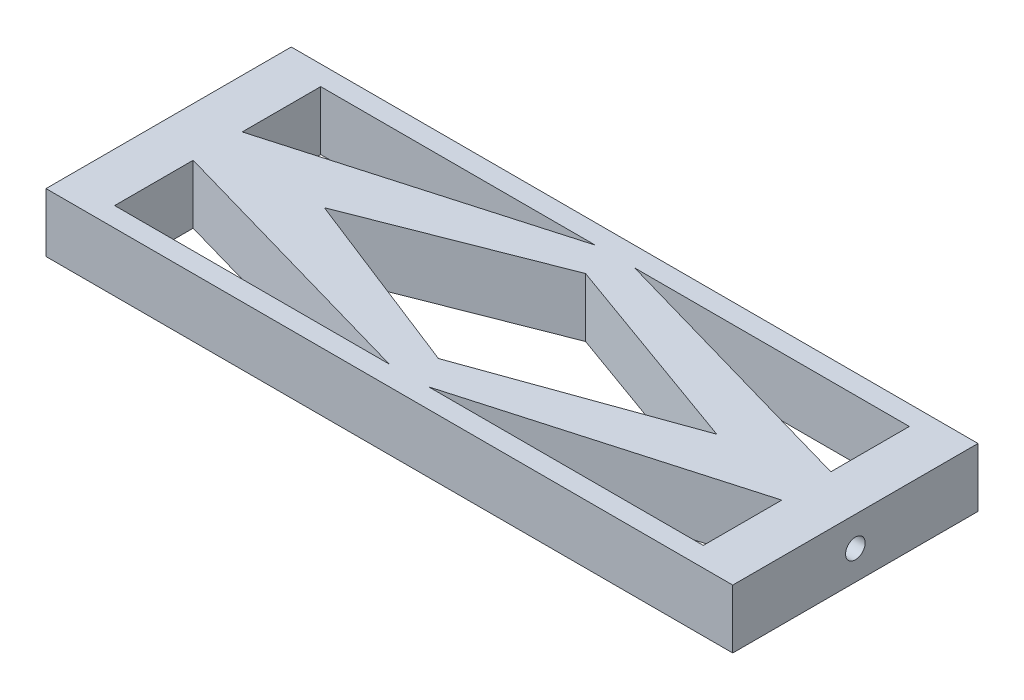
ISO-10303-21;
HEADER;
FILE_DESCRIPTION(('STEP AP214'),'2;1');
FILE_NAME('part.step','',(''),(''),'','','');
FILE_SCHEMA(('AUTOMOTIVE_DESIGN { 1 0 10303 214 1 1 1 1 }'));
ENDSEC;
DATA;
#1=APPLICATION_CONTEXT('core data for automotive mechanical design processes');
#2=APPLICATION_PROTOCOL_DEFINITION('international standard','automotive_design',2000,#1);
#3=PRODUCT_CONTEXT('',#1,'mechanical');
#4=PRODUCT('Part','Part','',(#3));
#5=PRODUCT_RELATED_PRODUCT_CATEGORY('part','',(#4));
#6=PRODUCT_DEFINITION_FORMATION('','',#4);
#7=PRODUCT_DEFINITION_CONTEXT('part definition',#1,'design');
#8=PRODUCT_DEFINITION('design','',#6,#7);
#9=PRODUCT_DEFINITION_SHAPE('','',#8);
#10=(LENGTH_UNIT() NAMED_UNIT(*) SI_UNIT(.MILLI.,.METRE.));
#11=(NAMED_UNIT(*) PLANE_ANGLE_UNIT() SI_UNIT($,.RADIAN.));
#12=(NAMED_UNIT(*) SI_UNIT($,.STERADIAN.) SOLID_ANGLE_UNIT());
#13=UNCERTAINTY_MEASURE_WITH_UNIT(LENGTH_MEASURE(1.E-05),#10,'distance_accuracy_value','');
#14=(GEOMETRIC_REPRESENTATION_CONTEXT(3) GLOBAL_UNCERTAINTY_ASSIGNED_CONTEXT((#13)) GLOBAL_UNIT_ASSIGNED_CONTEXT((#10,
#11,#12)) REPRESENTATION_CONTEXT('',''));
#15=CARTESIAN_POINT('',(0.,0.,0.));
#16=DIRECTION('',(0.,0.,1.));
#17=DIRECTION('',(1.,0.,0.));
#18=AXIS2_PLACEMENT_3D('',#15,#16,#17);
#19=CARTESIAN_POINT('',(-44.45,7.62,15.875));
#20=DIRECTION('',(1.,0.,0.));
#21=DIRECTION('',(0.,0.,-1.));
#22=AXIS2_PLACEMENT_3D('',#19,#20,#21);
#23=PLANE('',#22);
#24=CARTESIAN_POINT('',(-44.45,3.81,0.));
#25=DIRECTION('',(-1.,0.,0.));
#26=DIRECTION('',(0.,0.,1.));
#27=AXIS2_PLACEMENT_3D('',#24,#25,#26);
#28=CIRCLE('',#27,1.27);
#29=CARTESIAN_POINT('',(-44.45,3.81,1.27));
#30=VERTEX_POINT('',#29);
#31=EDGE_CURVE('E431',#30,#30,#28,.T.);
#32=ORIENTED_EDGE('',*,*,#31,.F.);
#33=EDGE_LOOP('',(#32));
#34=FACE_BOUND('',#33,.T.);
#35=DIRECTION('',(0.,0.,1.));
#36=VECTOR('',#35,1.);
#37=CARTESIAN_POINT('',(-44.45,0.,15.875));
#38=LINE('',#37,#36);
#39=CARTESIAN_POINT('',(-44.45,0.,-15.875));
#40=VERTEX_POINT('',#39);
#41=CARTESIAN_POINT('',(-44.45,0.,15.875));
#42=VERTEX_POINT('',#41);
#43=EDGE_CURVE('E293',#40,#42,#38,.T.);
#44=ORIENTED_EDGE('',*,*,#43,.T.);
#45=DIRECTION('',(0.,-1.,0.));
#46=VECTOR('',#45,1.);
#47=CARTESIAN_POINT('',(-44.45,7.62,15.875));
#48=LINE('',#47,#46);
#49=CARTESIAN_POINT('',(-44.45,7.62,15.875));
#50=VERTEX_POINT('',#49);
#51=EDGE_CURVE('E336',#50,#42,#48,.T.);
#52=ORIENTED_EDGE('',*,*,#51,.F.);
#53=DIRECTION('',(0.,0.,1.));
#54=VECTOR('',#53,1.);
#55=CARTESIAN_POINT('',(-44.45,7.62,15.875));
#56=LINE('',#55,#54);
#57=CARTESIAN_POINT('',(-44.45,7.62,-15.875));
#58=VERTEX_POINT('',#57);
#59=EDGE_CURVE('E305',#58,#50,#56,.T.);
#60=ORIENTED_EDGE('',*,*,#59,.F.);
#61=DIRECTION('',(0.,-1.,0.));
#62=VECTOR('',#61,1.);
#63=CARTESIAN_POINT('',(-44.45,7.62,-15.875));
#64=LINE('',#63,#62);
#65=EDGE_CURVE('E316',#58,#40,#64,.T.);
#66=ORIENTED_EDGE('',*,*,#65,.T.);
#67=EDGE_LOOP('',(#44,#52,#60,#66));
#68=FACE_BOUND('',#67,.T.);
#69=ADVANCED_FACE('F44',(#34,#68),#23,.F.);
#70=CARTESIAN_POINT('',(44.45,7.62,15.875));
#71=DIRECTION('',(0.,0.,-1.));
#72=DIRECTION('',(-1.,0.,0.));
#73=AXIS2_PLACEMENT_3D('',#70,#71,#72);
#74=PLANE('',#73);
#75=DIRECTION('',(1.,0.,0.));
#76=VECTOR('',#75,1.);
#77=CARTESIAN_POINT('',(44.45,0.,15.875));
#78=LINE('',#77,#76);
#79=CARTESIAN_POINT('',(44.45,0.,15.875));
#80=VERTEX_POINT('',#79);
#81=EDGE_CURVE('E319',#42,#80,#78,.T.);
#82=ORIENTED_EDGE('',*,*,#81,.T.);
#83=DIRECTION('',(0.,-1.,0.));
#84=VECTOR('',#83,1.);
#85=CARTESIAN_POINT('',(44.45,7.62,15.875));
#86=LINE('',#85,#84);
#87=CARTESIAN_POINT('',(44.45,7.62,15.875));
#88=VERTEX_POINT('',#87);
#89=EDGE_CURVE('E333',#88,#80,#86,.T.);
#90=ORIENTED_EDGE('',*,*,#89,.F.);
#91=DIRECTION('',(1.,0.,0.));
#92=VECTOR('',#91,1.);
#93=CARTESIAN_POINT('',(44.45,7.62,15.875));
#94=LINE('',#93,#92);
#95=EDGE_CURVE('E308',#50,#88,#94,.T.);
#96=ORIENTED_EDGE('',*,*,#95,.F.);
#97=ORIENTED_EDGE('',*,*,#51,.T.);
#98=EDGE_LOOP('',(#82,#90,#96,#97));
#99=FACE_BOUND('',#98,.T.);
#100=ADVANCED_FACE('F420',(#99),#74,.F.);
#101=CARTESIAN_POINT('',(44.45,7.62,15.875));
#102=DIRECTION('',(-1.,0.,0.));
#103=DIRECTION('',(0.,0.,1.));
#104=AXIS2_PLACEMENT_3D('',#101,#102,#103);
#105=PLANE('',#104);
#106=CARTESIAN_POINT('',(44.45,3.78692589120411,0.));
#107=DIRECTION('',(1.,0.,0.));
#108=DIRECTION('',(0.,0.,-1.));
#109=AXIS2_PLACEMENT_3D('',#106,#107,#108);
#110=CIRCLE('',#109,1.27);
#111=CARTESIAN_POINT('',(44.45,3.78692589120411,-1.27));
#112=VERTEX_POINT('',#111);
#113=EDGE_CURVE('E665',#112,#112,#110,.T.);
#114=ORIENTED_EDGE('',*,*,#113,.F.);
#115=EDGE_LOOP('',(#114));
#116=FACE_BOUND('',#115,.T.);
#117=DIRECTION('',(0.,0.,-1.));
#118=VECTOR('',#117,1.);
#119=CARTESIAN_POINT('',(44.45,0.,15.875));
#120=LINE('',#119,#118);
#121=CARTESIAN_POINT('',(44.45,0.,-15.875));
#122=VERTEX_POINT('',#121);
#123=EDGE_CURVE('E323',#80,#122,#120,.T.);
#124=ORIENTED_EDGE('',*,*,#123,.T.);
#125=DIRECTION('',(0.,-1.,0.));
#126=VECTOR('',#125,1.);
#127=CARTESIAN_POINT('',(44.45,7.62,-15.875));
#128=LINE('',#127,#126);
#129=CARTESIAN_POINT('',(44.45,7.62,-15.875));
#130=VERTEX_POINT('',#129);
#131=EDGE_CURVE('E332',#130,#122,#128,.T.);
#132=ORIENTED_EDGE('',*,*,#131,.F.);
#133=DIRECTION('',(0.,0.,-1.));
#134=VECTOR('',#133,1.);
#135=CARTESIAN_POINT('',(44.45,7.62,15.875));
#136=LINE('',#135,#134);
#137=EDGE_CURVE('E309',#88,#130,#136,.T.);
#138=ORIENTED_EDGE('',*,*,#137,.F.);
#139=ORIENTED_EDGE('',*,*,#89,.T.);
#140=EDGE_LOOP('',(#124,#132,#138,#139));
#141=FACE_BOUND('',#140,.T.);
#142=ADVANCED_FACE('F426',(#116,#141),#105,.F.);
#143=CARTESIAN_POINT('',(44.45,7.62,-15.875));
#144=DIRECTION('',(0.,0.,1.));
#145=DIRECTION('',(1.,0.,0.));
#146=AXIS2_PLACEMENT_3D('',#143,#144,#145);
#147=PLANE('',#146);
#148=DIRECTION('',(-1.,0.,0.));
#149=VECTOR('',#148,1.);
#150=CARTESIAN_POINT('',(44.45,0.,-15.875));
#151=LINE('',#150,#149);
#152=EDGE_CURVE('E307',#122,#40,#151,.T.);
#153=ORIENTED_EDGE('',*,*,#152,.T.);
#154=ORIENTED_EDGE('',*,*,#65,.F.);
#155=DIRECTION('',(-1.,0.,0.));
#156=VECTOR('',#155,1.);
#157=CARTESIAN_POINT('',(44.45,7.62,-15.875));
#158=LINE('',#157,#156);
#159=EDGE_CURVE('E311',#130,#58,#158,.T.);
#160=ORIENTED_EDGE('',*,*,#159,.F.);
#161=ORIENTED_EDGE('',*,*,#131,.T.);
#162=EDGE_LOOP('',(#153,#154,#160,#161));
#163=FACE_BOUND('',#162,.T.);
#164=ADVANCED_FACE('F443',(#163),#147,.F.);
#165=CARTESIAN_POINT('',(0.,7.62,0.));
#166=DIRECTION('',(0.,1.,0.));
#167=DIRECTION('',(0.,0.,1.));
#168=AXIS2_PLACEMENT_3D('',#165,#166,#167);
#169=PLANE('',#168);
#170=DIRECTION('',(-0.941087833487294,0.,-0.338162223884028));
#171=VECTOR('',#170,1.);
#172=CARTESIAN_POINT('',(26.5075782593641,7.62,0.));
#173=LINE('',#172,#171);
#174=CARTESIAN_POINT('',(26.5075782593641,7.62,0.));
#175=VERTEX_POINT('',#174);
#176=CARTESIAN_POINT('',(0.,7.62,-9.525));
#177=VERTEX_POINT('',#176);
#178=EDGE_CURVE('E58',#175,#177,#173,.T.);
#179=ORIENTED_EDGE('',*,*,#178,.F.);
#180=DIRECTION('',(0.941087833487294,0.,-0.338162223884029));
#181=VECTOR('',#180,1.);
#182=CARTESIAN_POINT('',(0.,7.62,9.525));
#183=LINE('',#182,#181);
#184=CARTESIAN_POINT('',(0.,7.62,9.525));
#185=VERTEX_POINT('',#184);
#186=EDGE_CURVE('E201',#185,#175,#183,.T.);
#187=ORIENTED_EDGE('',*,*,#186,.F.);
#188=DIRECTION('',(0.930991953296633,0.,0.365039700439446));
#189=VECTOR('',#188,1.);
#190=CARTESIAN_POINT('',(-24.2924217406359,7.62,0.));
#191=LINE('',#190,#189);
#192=CARTESIAN_POINT('',(-24.2924217406359,7.62,0.));
#193=VERTEX_POINT('',#192);
#194=EDGE_CURVE('E183',#193,#185,#191,.T.);
#195=ORIENTED_EDGE('',*,*,#194,.F.);
#196=DIRECTION('',(-0.930991953296633,0.,0.365039700439446));
#197=VECTOR('',#196,1.);
#198=CARTESIAN_POINT('',(0.,7.62,-9.525));
#199=LINE('',#198,#197);
#200=EDGE_CURVE('E193',#177,#193,#199,.T.);
#201=ORIENTED_EDGE('',*,*,#200,.F.);
#202=EDGE_LOOP('',(#179,#187,#195,#201));
#203=FACE_BOUND('',#202,.T.);
#204=DIRECTION('',(-0.961474939175395,0.,-0.274892599641515));
#205=VECTOR('',#204,1.);
#206=CARTESIAN_POINT('',(-2.56399286571872,7.62,13.335));
#207=LINE('',#206,#205);
#208=CARTESIAN_POINT('',(-2.56399286571872,7.62,13.335));
#209=VERTEX_POINT('',#208);
#210=CARTESIAN_POINT('',(-38.1,7.62,3.175));
#211=VERTEX_POINT('',#210);
#212=EDGE_CURVE('E256',#209,#211,#207,.T.);
#213=ORIENTED_EDGE('',*,*,#212,.F.);
#214=DIRECTION('',(1.,0.,0.));
#215=VECTOR('',#214,1.);
#216=CARTESIAN_POINT('',(-38.1,7.62,13.335));
#217=LINE('',#216,#215);
#218=CARTESIAN_POINT('',(-38.1,7.62,13.335));
#219=VERTEX_POINT('',#218);
#220=EDGE_CURVE('E245',#219,#209,#217,.T.);
#221=ORIENTED_EDGE('',*,*,#220,.F.);
#222=DIRECTION('',(0.,0.,1.));
#223=VECTOR('',#222,1.);
#224=CARTESIAN_POINT('',(-38.1,7.62,3.175));
#225=LINE('',#224,#223);
#226=EDGE_CURVE('E255',#211,#219,#225,.T.);
#227=ORIENTED_EDGE('',*,*,#226,.F.);
#228=EDGE_LOOP('',(#213,#221,#227));
#229=FACE_BOUND('',#228,.T.);
#230=DIRECTION('',(0.961523947640823,0.,0.274721127897378));
#231=VECTOR('',#230,1.);
#232=CARTESIAN_POINT('',(38.1,7.62,-3.17500000000001));
#233=LINE('',#232,#231);
#234=CARTESIAN_POINT('',(2.54,7.62,-13.335));
#235=VERTEX_POINT('',#234);
#236=CARTESIAN_POINT('',(38.1,7.62,-3.17500000000001));
#237=VERTEX_POINT('',#236);
#238=EDGE_CURVE('E248',#235,#237,#233,.T.);
#239=ORIENTED_EDGE('',*,*,#238,.F.);
#240=DIRECTION('',(-1.,0.,0.));
#241=VECTOR('',#240,1.);
#242=CARTESIAN_POINT('',(2.54,7.62,-13.335));
#243=LINE('',#242,#241);
#244=CARTESIAN_POINT('',(38.1,7.62,-13.335));
#245=VERTEX_POINT('',#244);
#246=EDGE_CURVE('E266',#245,#235,#243,.T.);
#247=ORIENTED_EDGE('',*,*,#246,.F.);
#248=DIRECTION('',(0.,0.,-1.));
#249=VECTOR('',#248,1.);
#250=CARTESIAN_POINT('',(38.1,7.62,-13.335));
#251=LINE('',#250,#249);
#252=EDGE_CURVE('E274',#237,#245,#251,.T.);
#253=ORIENTED_EDGE('',*,*,#252,.F.);
#254=EDGE_LOOP('',(#239,#247,#253));
#255=FACE_BOUND('',#254,.T.);
#256=DIRECTION('',(-0.961523947640823,0.,0.274721127897378));
#257=VECTOR('',#256,1.);
#258=CARTESIAN_POINT('',(2.54000000000001,7.62,13.335));
#259=LINE('',#258,#257);
#260=CARTESIAN_POINT('',(38.1,7.62,3.175));
#261=VERTEX_POINT('',#260);
#262=CARTESIAN_POINT('',(2.54000000000001,7.62,13.335));
#263=VERTEX_POINT('',#262);
#264=EDGE_CURVE('E233',#261,#263,#259,.T.);
#265=ORIENTED_EDGE('',*,*,#264,.F.);
#266=DIRECTION('',(0.,0.,-1.));
#267=VECTOR('',#266,1.);
#268=CARTESIAN_POINT('',(38.1,7.62,3.175));
#269=LINE('',#268,#267);
#270=CARTESIAN_POINT('',(38.1,7.62,13.335));
#271=VERTEX_POINT('',#270);
#272=EDGE_CURVE('E225',#271,#261,#269,.T.);
#273=ORIENTED_EDGE('',*,*,#272,.F.);
#274=DIRECTION('',(1.,0.,0.));
#275=VECTOR('',#274,1.);
#276=CARTESIAN_POINT('',(38.1,7.62,13.335));
#277=LINE('',#276,#275);
#278=EDGE_CURVE('E232',#263,#271,#277,.T.);
#279=ORIENTED_EDGE('',*,*,#278,.F.);
#280=EDGE_LOOP('',(#265,#273,#279));
#281=FACE_BOUND('',#280,.T.);
#282=DIRECTION('',(0.961474939175395,0.,-0.274892599641515));
#283=VECTOR('',#282,1.);
#284=CARTESIAN_POINT('',(-2.56399286571872,7.62,-13.335));
#285=LINE('',#284,#283);
#286=CARTESIAN_POINT('',(-38.1,7.62,-3.17500000000001));
#287=VERTEX_POINT('',#286);
#288=CARTESIAN_POINT('',(-2.56399286571872,7.62,-13.335));
#289=VERTEX_POINT('',#288);
#290=EDGE_CURVE('E261',#287,#289,#285,.T.);
#291=ORIENTED_EDGE('',*,*,#290,.F.);
#292=DIRECTION('',(0.,0.,1.));
#293=VECTOR('',#292,1.);
#294=CARTESIAN_POINT('',(-38.1,7.62,-3.17500000000001));
#295=LINE('',#294,#293);
#296=CARTESIAN_POINT('',(-38.1,7.62,-13.335));
#297=VERTEX_POINT('',#296);
#298=EDGE_CURVE('E290',#297,#287,#295,.T.);
#299=ORIENTED_EDGE('',*,*,#298,.F.);
#300=DIRECTION('',(-1.,0.,0.));
#301=VECTOR('',#300,1.);
#302=CARTESIAN_POINT('',(-38.1,7.62,-13.335));
#303=LINE('',#302,#301);
#304=EDGE_CURVE('E285',#289,#297,#303,.T.);
#305=ORIENTED_EDGE('',*,*,#304,.F.);
#306=EDGE_LOOP('',(#291,#299,#305));
#307=FACE_BOUND('',#306,.T.);
#308=ORIENTED_EDGE('',*,*,#59,.T.);
#309=ORIENTED_EDGE('',*,*,#95,.T.);
#310=ORIENTED_EDGE('',*,*,#137,.T.);
#311=ORIENTED_EDGE('',*,*,#159,.T.);
#312=EDGE_LOOP('',(#308,#309,#310,#311));
#313=FACE_BOUND('',#312,.T.);
#314=ADVANCED_FACE('F199',(#203,#229,#255,#281,#307,#313),#169,.T.);
#315=CARTESIAN_POINT('',(0.,0.,0.));
#316=DIRECTION('',(0.,1.,0.));
#317=DIRECTION('',(0.,0.,1.));
#318=AXIS2_PLACEMENT_3D('',#315,#316,#317);
#319=PLANE('',#318);
#320=DIRECTION('',(0.941087833487294,0.,-0.338162223884029));
#321=VECTOR('',#320,1.);
#322=CARTESIAN_POINT('',(3.03123937796758,0.,8.43578110596762));
#323=LINE('',#322,#321);
#324=CARTESIAN_POINT('',(0.,0.,9.525));
#325=VERTEX_POINT('',#324);
#326=CARTESIAN_POINT('',(26.5075782593641,0.,0.));
#327=VERTEX_POINT('',#326);
#328=EDGE_CURVE('E52',#325,#327,#323,.T.);
#329=ORIENTED_EDGE('',*,*,#328,.T.);
#330=DIRECTION('',(-0.941087833487294,0.,-0.338162223884028));
#331=VECTOR('',#330,1.);
#332=CARTESIAN_POINT('',(3.03123937796758,0.,-8.43578110596762));
#333=LINE('',#332,#331);
#334=CARTESIAN_POINT('',(0.,0.,-9.525));
#335=VERTEX_POINT('',#334);
#336=EDGE_CURVE('E11',#327,#335,#333,.T.);
#337=ORIENTED_EDGE('',*,*,#336,.T.);
#338=DIRECTION('',(-0.930991953296633,0.,0.365039700439446));
#339=VECTOR('',#338,1.);
#340=CARTESIAN_POINT('',(-3.23706195115148,0.,-8.25575581290683));
#341=LINE('',#340,#339);
#342=CARTESIAN_POINT('',(-24.2924217406359,0.,0.));
#343=VERTEX_POINT('',#342);
#344=EDGE_CURVE('E392',#335,#343,#341,.T.);
#345=ORIENTED_EDGE('',*,*,#344,.T.);
#346=DIRECTION('',(0.930991953296633,0.,0.365039700439446));
#347=VECTOR('',#346,1.);
#348=CARTESIAN_POINT('',(-3.23706195115148,0.,8.25575581290683));
#349=LINE('',#348,#347);
#350=EDGE_CURVE('E190',#343,#325,#349,.T.);
#351=ORIENTED_EDGE('',*,*,#350,.T.);
#352=EDGE_LOOP('',(#329,#337,#345,#351));
#353=FACE_BOUND('',#352,.T.);
#354=DIRECTION('',(1.,0.,0.));
#355=VECTOR('',#354,1.);
#356=CARTESIAN_POINT('',(0.,0.,13.335));
#357=LINE('',#356,#355);
#358=CARTESIAN_POINT('',(-38.1,0.,13.335));
#359=VERTEX_POINT('',#358);
#360=CARTESIAN_POINT('',(-2.56399286571872,0.,13.335));
#361=VERTEX_POINT('',#360);
#362=EDGE_CURVE('E382',#359,#361,#357,.T.);
#363=ORIENTED_EDGE('',*,*,#362,.T.);
#364=DIRECTION('',(-0.961474939175395,0.,-0.274892599641515));
#365=VECTOR('',#364,1.);
#366=CARTESIAN_POINT('',(-3.71822231199154,0.,13.0049975005684));
#367=LINE('',#366,#365);
#368=CARTESIAN_POINT('',(-38.1,0.,3.175));
#369=VERTEX_POINT('',#368);
#370=EDGE_CURVE('E390',#361,#369,#367,.T.);
#371=ORIENTED_EDGE('',*,*,#370,.T.);
#372=DIRECTION('',(0.,0.,1.));
#373=VECTOR('',#372,1.);
#374=CARTESIAN_POINT('',(-38.1,0.,0.));
#375=LINE('',#374,#373);
#376=EDGE_CURVE('E377',#369,#359,#375,.T.);
#377=ORIENTED_EDGE('',*,*,#376,.T.);
#378=EDGE_LOOP('',(#363,#371,#377));
#379=FACE_BOUND('',#378,.T.);
#380=DIRECTION('',(-1.,0.,0.));
#381=VECTOR('',#380,1.);
#382=CARTESIAN_POINT('',(0.,0.,-13.335));
#383=LINE('',#382,#381);
#384=CARTESIAN_POINT('',(38.1,0.,-13.335));
#385=VERTEX_POINT('',#384);
#386=CARTESIAN_POINT('',(2.54,0.,-13.335));
#387=VERTEX_POINT('',#386);
#388=EDGE_CURVE('E371',#385,#387,#383,.T.);
#389=ORIENTED_EDGE('',*,*,#388,.T.);
#390=DIRECTION('',(0.961523947640823,0.,0.274721127897378));
#391=VECTOR('',#390,1.);
#392=CARTESIAN_POINT('',(3.71415094339623,0.,-12.9995283018868));
#393=LINE('',#392,#391);
#394=CARTESIAN_POINT('',(38.1,0.,-3.17500000000001));
#395=VERTEX_POINT('',#394);
#396=EDGE_CURVE('E374',#387,#395,#393,.T.);
#397=ORIENTED_EDGE('',*,*,#396,.T.);
#398=DIRECTION('',(0.,0.,-1.));
#399=VECTOR('',#398,1.);
#400=CARTESIAN_POINT('',(38.1,0.,0.));
#401=LINE('',#400,#399);
#402=EDGE_CURVE('E370',#395,#385,#401,.T.);
#403=ORIENTED_EDGE('',*,*,#402,.T.);
#404=EDGE_LOOP('',(#389,#397,#403));
#405=FACE_BOUND('',#404,.T.);
#406=DIRECTION('',(0.,0.,-1.));
#407=VECTOR('',#406,1.);
#408=CARTESIAN_POINT('',(38.1,0.,0.));
#409=LINE('',#408,#407);
#410=CARTESIAN_POINT('',(38.1,0.,13.335));
#411=VERTEX_POINT('',#410);
#412=CARTESIAN_POINT('',(38.1,0.,3.175));
#413=VERTEX_POINT('',#412);
#414=EDGE_CURVE('E356',#411,#413,#409,.T.);
#415=ORIENTED_EDGE('',*,*,#414,.T.);
#416=DIRECTION('',(-0.961523947640823,0.,0.274721127897378));
#417=VECTOR('',#416,1.);
#418=CARTESIAN_POINT('',(3.71415094339623,0.,12.9995283018868));
#419=LINE('',#418,#417);
#420=CARTESIAN_POINT('',(2.54000000000001,0.,13.335));
#421=VERTEX_POINT('',#420);
#422=EDGE_CURVE('E361',#413,#421,#419,.T.);
#423=ORIENTED_EDGE('',*,*,#422,.T.);
#424=DIRECTION('',(1.,0.,0.));
#425=VECTOR('',#424,1.);
#426=CARTESIAN_POINT('',(0.,0.,13.335));
#427=LINE('',#426,#425);
#428=EDGE_CURVE('E353',#421,#411,#427,.T.);
#429=ORIENTED_EDGE('',*,*,#428,.T.);
#430=EDGE_LOOP('',(#415,#423,#429));
#431=FACE_BOUND('',#430,.T.);
#432=DIRECTION('',(0.,0.,1.));
#433=VECTOR('',#432,1.);
#434=CARTESIAN_POINT('',(-38.1,0.,0.));
#435=LINE('',#434,#433);
#436=CARTESIAN_POINT('',(-38.1,0.,-13.335));
#437=VERTEX_POINT('',#436);
#438=CARTESIAN_POINT('',(-38.1,0.,-3.17500000000001));
#439=VERTEX_POINT('',#438);
#440=EDGE_CURVE('E350',#437,#439,#435,.T.);
#441=ORIENTED_EDGE('',*,*,#440,.T.);
#442=DIRECTION('',(0.961474939175395,0.,-0.274892599641515));
#443=VECTOR('',#442,1.);
#444=CARTESIAN_POINT('',(-3.71822231199154,0.,-13.0049975005684));
#445=LINE('',#444,#443);
#446=CARTESIAN_POINT('',(-2.56399286571872,0.,-13.335));
#447=VERTEX_POINT('',#446);
#448=EDGE_CURVE('E352',#439,#447,#445,.T.);
#449=ORIENTED_EDGE('',*,*,#448,.T.);
#450=DIRECTION('',(-1.,0.,0.));
#451=VECTOR('',#450,1.);
#452=CARTESIAN_POINT('',(0.,0.,-13.335));
#453=LINE('',#452,#451);
#454=EDGE_CURVE('E344',#447,#437,#453,.T.);
#455=ORIENTED_EDGE('',*,*,#454,.T.);
#456=EDGE_LOOP('',(#441,#449,#455));
#457=FACE_BOUND('',#456,.T.);
#458=ORIENTED_EDGE('',*,*,#43,.F.);
#459=ORIENTED_EDGE('',*,*,#152,.F.);
#460=ORIENTED_EDGE('',*,*,#123,.F.);
#461=ORIENTED_EDGE('',*,*,#81,.F.);
#462=EDGE_LOOP('',(#458,#459,#460,#461));
#463=FACE_BOUND('',#462,.T.);
#464=ADVANCED_FACE('F399',(#353,#379,#405,#431,#457,#463),#319,.F.);
#465=CARTESIAN_POINT('',(-2.56399286571872,-21.844,-13.335));
#466=DIRECTION('',(0.274892599641515,0.,0.961474939175395));
#467=DIRECTION('',(0.961474939175395,0.,-0.274892599641515));
#468=AXIS2_PLACEMENT_3D('',#465,#466,#467);
#469=PLANE('',#468);
#470=DIRECTION('',(0.,1.,0.));
#471=VECTOR('',#470,1.);
#472=CARTESIAN_POINT('',(-38.1,-21.844,-3.17500000000001));
#473=LINE('',#472,#471);
#474=EDGE_CURVE('E295',#439,#287,#473,.T.);
#475=ORIENTED_EDGE('',*,*,#474,.T.);
#476=ORIENTED_EDGE('',*,*,#290,.T.);
#477=DIRECTION('',(0.,1.,0.));
#478=VECTOR('',#477,1.);
#479=CARTESIAN_POINT('',(-2.56399286571872,-21.844,-13.335));
#480=LINE('',#479,#478);
#481=EDGE_CURVE('E292',#447,#289,#480,.T.);
#482=ORIENTED_EDGE('',*,*,#481,.F.);
#483=ORIENTED_EDGE('',*,*,#448,.F.);
#484=EDGE_LOOP('',(#475,#476,#482,#483));
#485=FACE_BOUND('',#484,.T.);
#486=ADVANCED_FACE('F459',(#485),#469,.F.);
#487=CARTESIAN_POINT('',(-38.1,-21.844,-3.17500000000001));
#488=DIRECTION('',(-1.,0.,0.));
#489=DIRECTION('',(0.,0.,1.));
#490=AXIS2_PLACEMENT_3D('',#487,#488,#489);
#491=PLANE('',#490);
#492=DIRECTION('',(0.,1.,0.));
#493=VECTOR('',#492,1.);
#494=CARTESIAN_POINT('',(-38.1,-21.844,-13.335));
#495=LINE('',#494,#493);
#496=EDGE_CURVE('E297',#437,#297,#495,.T.);
#497=ORIENTED_EDGE('',*,*,#496,.T.);
#498=ORIENTED_EDGE('',*,*,#298,.T.);
#499=ORIENTED_EDGE('',*,*,#474,.F.);
#500=ORIENTED_EDGE('',*,*,#440,.F.);
#501=EDGE_LOOP('',(#497,#498,#499,#500));
#502=FACE_BOUND('',#501,.T.);
#503=ADVANCED_FACE('F461',(#502),#491,.F.);
#504=CARTESIAN_POINT('',(-38.1,-21.844,-13.335));
#505=DIRECTION('',(0.,0.,-1.));
#506=DIRECTION('',(-1.,0.,0.));
#507=AXIS2_PLACEMENT_3D('',#504,#505,#506);
#508=PLANE('',#507);
#509=ORIENTED_EDGE('',*,*,#481,.T.);
#510=ORIENTED_EDGE('',*,*,#304,.T.);
#511=ORIENTED_EDGE('',*,*,#496,.F.);
#512=ORIENTED_EDGE('',*,*,#454,.F.);
#513=EDGE_LOOP('',(#509,#510,#511,#512));
#514=FACE_BOUND('',#513,.T.);
#515=ADVANCED_FACE('F467',(#514),#508,.F.);
#516=CARTESIAN_POINT('',(2.54000000000001,-21.844,13.335));
#517=DIRECTION('',(-0.274721127897378,0.,-0.961523947640823));
#518=DIRECTION('',(-0.961523947640823,0.,0.274721127897378));
#519=AXIS2_PLACEMENT_3D('',#516,#517,#518);
#520=PLANE('',#519);
#521=DIRECTION('',(0.,1.,0.));
#522=VECTOR('',#521,1.);
#523=CARTESIAN_POINT('',(38.1,-21.844,3.175));
#524=LINE('',#523,#522);
#525=EDGE_CURVE('E213',#413,#261,#524,.T.);
#526=ORIENTED_EDGE('',*,*,#525,.T.);
#527=ORIENTED_EDGE('',*,*,#264,.T.);
#528=DIRECTION('',(0.,1.,0.));
#529=VECTOR('',#528,1.);
#530=CARTESIAN_POINT('',(2.54000000000001,-21.844,13.335));
#531=LINE('',#530,#529);
#532=EDGE_CURVE('E217',#421,#263,#531,.T.);
#533=ORIENTED_EDGE('',*,*,#532,.F.);
#534=ORIENTED_EDGE('',*,*,#422,.F.);
#535=EDGE_LOOP('',(#526,#527,#533,#534));
#536=FACE_BOUND('',#535,.T.);
#537=ADVANCED_FACE('F466',(#536),#520,.F.);
#538=CARTESIAN_POINT('',(38.1,-21.844,3.175));
#539=DIRECTION('',(1.,0.,0.));
#540=DIRECTION('',(0.,0.,-1.));
#541=AXIS2_PLACEMENT_3D('',#538,#539,#540);
#542=PLANE('',#541);
#543=DIRECTION('',(0.,1.,0.));
#544=VECTOR('',#543,1.);
#545=CARTESIAN_POINT('',(38.1,-21.844,13.335));
#546=LINE('',#545,#544);
#547=EDGE_CURVE('E224',#411,#271,#546,.T.);
#548=ORIENTED_EDGE('',*,*,#547,.T.);
#549=ORIENTED_EDGE('',*,*,#272,.T.);
#550=ORIENTED_EDGE('',*,*,#525,.F.);
#551=ORIENTED_EDGE('',*,*,#414,.F.);
#552=EDGE_LOOP('',(#548,#549,#550,#551));
#553=FACE_BOUND('',#552,.T.);
#554=ADVANCED_FACE('F493',(#553),#542,.F.);
#555=CARTESIAN_POINT('',(38.1,-21.844,13.335));
#556=DIRECTION('',(0.,0.,1.));
#557=DIRECTION('',(1.,0.,0.));
#558=AXIS2_PLACEMENT_3D('',#555,#556,#557);
#559=PLANE('',#558);
#560=ORIENTED_EDGE('',*,*,#532,.T.);
#561=ORIENTED_EDGE('',*,*,#278,.T.);
#562=ORIENTED_EDGE('',*,*,#547,.F.);
#563=ORIENTED_EDGE('',*,*,#428,.F.);
#564=EDGE_LOOP('',(#560,#561,#562,#563));
#565=FACE_BOUND('',#564,.T.);
#566=ADVANCED_FACE('F486',(#565),#559,.F.);
#567=CARTESIAN_POINT('',(38.1,-21.844,-3.17500000000001));
#568=DIRECTION('',(-0.274721127897378,0.,0.961523947640823));
#569=DIRECTION('',(0.961523947640823,0.,0.274721127897378));
#570=AXIS2_PLACEMENT_3D('',#567,#568,#569);
#571=PLANE('',#570);
#572=DIRECTION('',(0.,1.,0.));
#573=VECTOR('',#572,1.);
#574=CARTESIAN_POINT('',(2.54,-21.844,-13.335));
#575=LINE('',#574,#573);
#576=EDGE_CURVE('E236',#387,#235,#575,.T.);
#577=ORIENTED_EDGE('',*,*,#576,.T.);
#578=ORIENTED_EDGE('',*,*,#238,.T.);
#579=DIRECTION('',(0.,1.,0.));
#580=VECTOR('',#579,1.);
#581=CARTESIAN_POINT('',(38.1,-21.844,-3.17500000000001));
#582=LINE('',#581,#580);
#583=EDGE_CURVE('E265',#395,#237,#582,.T.);
#584=ORIENTED_EDGE('',*,*,#583,.F.);
#585=ORIENTED_EDGE('',*,*,#396,.F.);
#586=EDGE_LOOP('',(#577,#578,#584,#585));
#587=FACE_BOUND('',#586,.T.);
#588=ADVANCED_FACE('F476',(#587),#571,.F.);
#589=CARTESIAN_POINT('',(2.54,-21.844,-13.335));
#590=DIRECTION('',(0.,0.,-1.));
#591=DIRECTION('',(-1.,0.,0.));
#592=AXIS2_PLACEMENT_3D('',#589,#590,#591);
#593=PLANE('',#592);
#594=DIRECTION('',(0.,1.,0.));
#595=VECTOR('',#594,1.);
#596=CARTESIAN_POINT('',(38.1,-21.844,-13.335));
#597=LINE('',#596,#595);
#598=EDGE_CURVE('E270',#385,#245,#597,.T.);
#599=ORIENTED_EDGE('',*,*,#598,.T.);
#600=ORIENTED_EDGE('',*,*,#246,.T.);
#601=ORIENTED_EDGE('',*,*,#576,.F.);
#602=ORIENTED_EDGE('',*,*,#388,.F.);
#603=EDGE_LOOP('',(#599,#600,#601,#602));
#604=FACE_BOUND('',#603,.T.);
#605=ADVANCED_FACE('F475',(#604),#593,.F.);
#606=CARTESIAN_POINT('',(38.1,-21.844,-13.335));
#607=DIRECTION('',(1.,0.,0.));
#608=DIRECTION('',(0.,0.,-1.));
#609=AXIS2_PLACEMENT_3D('',#606,#607,#608);
#610=PLANE('',#609);
#611=ORIENTED_EDGE('',*,*,#583,.T.);
#612=ORIENTED_EDGE('',*,*,#252,.T.);
#613=ORIENTED_EDGE('',*,*,#598,.F.);
#614=ORIENTED_EDGE('',*,*,#402,.F.);
#615=EDGE_LOOP('',(#611,#612,#613,#614));
#616=FACE_BOUND('',#615,.T.);
#617=ADVANCED_FACE('F480',(#616),#610,.F.);
#618=CARTESIAN_POINT('',(-2.56399286571872,-21.844,13.335));
#619=DIRECTION('',(0.274892599641515,0.,-0.961474939175395));
#620=DIRECTION('',(-0.961474939175395,0.,-0.274892599641515));
#621=AXIS2_PLACEMENT_3D('',#618,#619,#620);
#622=PLANE('',#621);
#623=DIRECTION('',(0.,1.,0.));
#624=VECTOR('',#623,1.);
#625=CARTESIAN_POINT('',(-2.56399286571872,-21.844,13.335));
#626=LINE('',#625,#624);
#627=EDGE_CURVE('E250',#361,#209,#626,.T.);
#628=ORIENTED_EDGE('',*,*,#627,.T.);
#629=ORIENTED_EDGE('',*,*,#212,.T.);
#630=DIRECTION('',(0.,1.,0.));
#631=VECTOR('',#630,1.);
#632=CARTESIAN_POINT('',(-38.1,-21.844,3.175));
#633=LINE('',#632,#631);
#634=EDGE_CURVE('E239',#369,#211,#633,.T.);
#635=ORIENTED_EDGE('',*,*,#634,.F.);
#636=ORIENTED_EDGE('',*,*,#370,.F.);
#637=EDGE_LOOP('',(#628,#629,#635,#636));
#638=FACE_BOUND('',#637,.T.);
#639=ADVANCED_FACE('F485',(#638),#622,.F.);
#640=CARTESIAN_POINT('',(-38.1,-21.844,13.335));
#641=DIRECTION('',(0.,0.,1.));
#642=DIRECTION('',(1.,0.,0.));
#643=AXIS2_PLACEMENT_3D('',#640,#641,#642);
#644=PLANE('',#643);
#645=DIRECTION('',(0.,1.,0.));
#646=VECTOR('',#645,1.);
#647=CARTESIAN_POINT('',(-38.1,-21.844,13.335));
#648=LINE('',#647,#646);
#649=EDGE_CURVE('E241',#359,#219,#648,.T.);
#650=ORIENTED_EDGE('',*,*,#649,.T.);
#651=ORIENTED_EDGE('',*,*,#220,.T.);
#652=ORIENTED_EDGE('',*,*,#627,.F.);
#653=ORIENTED_EDGE('',*,*,#362,.F.);
#654=EDGE_LOOP('',(#650,#651,#652,#653));
#655=FACE_BOUND('',#654,.T.);
#656=ADVANCED_FACE('F414',(#655),#644,.F.);
#657=CARTESIAN_POINT('',(-38.1,-21.844,3.175));
#658=DIRECTION('',(-1.,0.,0.));
#659=DIRECTION('',(0.,0.,1.));
#660=AXIS2_PLACEMENT_3D('',#657,#658,#659);
#661=PLANE('',#660);
#662=ORIENTED_EDGE('',*,*,#634,.T.);
#663=ORIENTED_EDGE('',*,*,#226,.T.);
#664=ORIENTED_EDGE('',*,*,#649,.F.);
#665=ORIENTED_EDGE('',*,*,#376,.F.);
#666=EDGE_LOOP('',(#662,#663,#664,#665));
#667=FACE_BOUND('',#666,.T.);
#668=ADVANCED_FACE('F403',(#667),#661,.F.);
#669=CARTESIAN_POINT('',(26.5075782593641,-21.844,0.));
#670=DIRECTION('',(0.338162223884028,0.,-0.941087833487294));
#671=DIRECTION('',(-0.941087833487294,0.,-0.338162223884028));
#672=AXIS2_PLACEMENT_3D('',#669,#670,#671);
#673=PLANE('',#672);
#674=DIRECTION('',(0.,1.,0.));
#675=VECTOR('',#674,1.);
#676=CARTESIAN_POINT('',(26.5075782593641,-21.844,0.));
#677=LINE('',#676,#675);
#678=EDGE_CURVE('E209',#327,#175,#677,.T.);
#679=ORIENTED_EDGE('',*,*,#678,.T.);
#680=ORIENTED_EDGE('',*,*,#178,.T.);
#681=DIRECTION('',(0.,1.,0.));
#682=VECTOR('',#681,1.);
#683=CARTESIAN_POINT('',(0.,-21.844,-9.525));
#684=LINE('',#683,#682);
#685=EDGE_CURVE('E195',#335,#177,#684,.T.);
#686=ORIENTED_EDGE('',*,*,#685,.F.);
#687=ORIENTED_EDGE('',*,*,#336,.F.);
#688=EDGE_LOOP('',(#679,#680,#686,#687));
#689=FACE_BOUND('',#688,.T.);
#690=ADVANCED_FACE('F401',(#689),#673,.F.);
#691=CARTESIAN_POINT('',(0.,-21.844,9.525));
#692=DIRECTION('',(0.338162223884029,0.,0.941087833487294));
#693=DIRECTION('',(0.941087833487294,0.,-0.338162223884029));
#694=AXIS2_PLACEMENT_3D('',#691,#692,#693);
#695=PLANE('',#694);
#696=DIRECTION('',(0.,1.,0.));
#697=VECTOR('',#696,1.);
#698=CARTESIAN_POINT('',(0.,-21.844,9.525));
#699=LINE('',#698,#697);
#700=EDGE_CURVE('E192',#325,#185,#699,.T.);
#701=ORIENTED_EDGE('',*,*,#700,.T.);
#702=ORIENTED_EDGE('',*,*,#186,.T.);
#703=ORIENTED_EDGE('',*,*,#678,.F.);
#704=ORIENTED_EDGE('',*,*,#328,.F.);
#705=EDGE_LOOP('',(#701,#702,#703,#704));
#706=FACE_BOUND('',#705,.T.);
#707=ADVANCED_FACE('F405',(#706),#695,.F.);
#708=CARTESIAN_POINT('',(-24.2924217406359,-21.844,0.));
#709=DIRECTION('',(-0.365039700439446,0.,0.930991953296633));
#710=DIRECTION('',(0.930991953296633,0.,0.365039700439446));
#711=AXIS2_PLACEMENT_3D('',#708,#709,#710);
#712=PLANE('',#711);
#713=DIRECTION('',(0.,1.,0.));
#714=VECTOR('',#713,1.);
#715=CARTESIAN_POINT('',(-24.2924217406359,-21.844,0.));
#716=LINE('',#715,#714);
#717=EDGE_CURVE('E69',#343,#193,#716,.T.);
#718=ORIENTED_EDGE('',*,*,#717,.T.);
#719=ORIENTED_EDGE('',*,*,#194,.T.);
#720=ORIENTED_EDGE('',*,*,#700,.F.);
#721=ORIENTED_EDGE('',*,*,#350,.F.);
#722=EDGE_LOOP('',(#718,#719,#720,#721));
#723=FACE_BOUND('',#722,.T.);
#724=ADVANCED_FACE('F185',(#723),#712,.F.);
#725=CARTESIAN_POINT('',(0.,-21.844,-9.525));
#726=DIRECTION('',(-0.365039700439446,0.,-0.930991953296633));
#727=DIRECTION('',(-0.930991953296633,0.,0.365039700439446));
#728=AXIS2_PLACEMENT_3D('',#725,#726,#727);
#729=PLANE('',#728);
#730=ORIENTED_EDGE('',*,*,#685,.T.);
#731=ORIENTED_EDGE('',*,*,#200,.T.);
#732=ORIENTED_EDGE('',*,*,#717,.F.);
#733=ORIENTED_EDGE('',*,*,#344,.F.);
#734=EDGE_LOOP('',(#730,#731,#732,#733));
#735=FACE_BOUND('',#734,.T.);
#736=ADVANCED_FACE('F198',(#735),#729,.F.);
#737=CARTESIAN_POINT('',(36.83,3.78692589120411,0.));
#738=DIRECTION('',(1.,0.,0.));
#739=DIRECTION('',(0.,0.,-1.));
#740=AXIS2_PLACEMENT_3D('',#737,#738,#739);
#741=CYLINDRICAL_SURFACE('',#740,1.27);
#742=CARTESIAN_POINT('',(36.83,3.78692589120411,0.));
#743=DIRECTION('',(1.,0.,0.));
#744=DIRECTION('',(0.,0.,-1.));
#745=AXIS2_PLACEMENT_3D('',#742,#743,#744);
#746=CIRCLE('',#745,1.27);
#747=CARTESIAN_POINT('',(36.83,3.78692589120411,-1.27));
#748=VERTEX_POINT('',#747);
#749=EDGE_CURVE('E669',#748,#748,#746,.T.);
#750=CARTESIAN_POINT('',(36.83,3.78692589120411,-1.27));
#751=CARTESIAN_POINT('',(36.909375,3.78692589120411,-1.27));
#752=CARTESIAN_POINT('',(36.98875,3.78692589120411,-1.27));
#753=CARTESIAN_POINT('',(37.1475,3.78692589120411,-1.27));
#754=CARTESIAN_POINT('',(37.226875,3.78692589120411,-1.27));
#755=CARTESIAN_POINT('',(37.385625,3.78692589120411,-1.27));
#756=CARTESIAN_POINT('',(37.465,3.78692589120411,-1.27));
#757=CARTESIAN_POINT('',(37.62375,3.78692589120411,-1.27));
#758=CARTESIAN_POINT('',(37.703125,3.78692589120411,-1.27));
#759=CARTESIAN_POINT('',(37.861875,3.78692589120411,-1.27));
#760=CARTESIAN_POINT('',(37.94125,3.78692589120411,-1.27));
#761=CARTESIAN_POINT('',(38.1,3.78692589120411,-1.27));
#762=CARTESIAN_POINT('',(38.179375,3.78692589120411,-1.27));
#763=CARTESIAN_POINT('',(38.338125,3.78692589120411,-1.27));
#764=CARTESIAN_POINT('',(38.4175,3.78692589120411,-1.27));
#765=CARTESIAN_POINT('',(38.57625,3.78692589120411,-1.27));
#766=CARTESIAN_POINT('',(38.655625,3.78692589120411,-1.27));
#767=CARTESIAN_POINT('',(38.814375,3.78692589120411,-1.27));
#768=CARTESIAN_POINT('',(38.89375,3.78692589120411,-1.27));
#769=CARTESIAN_POINT('',(39.0525,3.78692589120411,-1.27));
#770=CARTESIAN_POINT('',(39.131875,3.78692589120411,-1.27));
#771=CARTESIAN_POINT('',(39.290625,3.78692589120411,-1.27));
#772=CARTESIAN_POINT('',(39.37,3.78692589120411,-1.27));
#773=CARTESIAN_POINT('',(39.52875,3.78692589120411,-1.27));
#774=CARTESIAN_POINT('',(39.608125,3.78692589120411,-1.27));
#775=CARTESIAN_POINT('',(39.766875,3.78692589120411,-1.27));
#776=CARTESIAN_POINT('',(39.84625,3.78692589120411,-1.27));
#777=CARTESIAN_POINT('',(40.005,3.78692589120411,-1.27));
#778=CARTESIAN_POINT('',(40.084375,3.78692589120411,-1.27));
#779=CARTESIAN_POINT('',(40.243125,3.78692589120411,-1.27));
#780=CARTESIAN_POINT('',(40.3225,3.78692589120411,-1.27));
#781=CARTESIAN_POINT('',(40.48125,3.78692589120411,-1.27));
#782=CARTESIAN_POINT('',(40.560625,3.78692589120411,-1.27));
#783=CARTESIAN_POINT('',(40.719375,3.78692589120411,-1.27));
#784=CARTESIAN_POINT('',(40.79875,3.78692589120411,-1.27));
#785=CARTESIAN_POINT('',(40.9575,3.78692589120411,-1.27));
#786=CARTESIAN_POINT('',(41.036875,3.78692589120411,-1.27));
#787=CARTESIAN_POINT('',(41.195625,3.78692589120411,-1.27));
#788=CARTESIAN_POINT('',(41.275,3.78692589120411,-1.27));
#789=CARTESIAN_POINT('',(41.43375,3.78692589120411,-1.27));
#790=CARTESIAN_POINT('',(41.513125,3.78692589120411,-1.27));
#791=CARTESIAN_POINT('',(41.671875,3.78692589120411,-1.27));
#792=CARTESIAN_POINT('',(41.75125,3.78692589120411,-1.27));
#793=CARTESIAN_POINT('',(41.91,3.78692589120411,-1.27));
#794=CARTESIAN_POINT('',(41.989375,3.78692589120411,-1.27));
#795=CARTESIAN_POINT('',(42.148125,3.78692589120411,-1.27));
#796=CARTESIAN_POINT('',(42.2275,3.78692589120411,-1.27));
#797=CARTESIAN_POINT('',(42.38625,3.78692589120411,-1.27));
#798=CARTESIAN_POINT('',(42.465625,3.78692589120411,-1.27));
#799=CARTESIAN_POINT('',(42.624375,3.78692589120411,-1.27));
#800=CARTESIAN_POINT('',(42.70375,3.78692589120411,-1.27));
#801=CARTESIAN_POINT('',(42.8625,3.78692589120411,-1.27));
#802=CARTESIAN_POINT('',(42.941875,3.78692589120411,-1.27));
#803=CARTESIAN_POINT('',(43.100625,3.78692589120411,-1.27));
#804=CARTESIAN_POINT('',(43.18,3.78692589120411,-1.27));
#805=CARTESIAN_POINT('',(43.33875,3.78692589120411,-1.27));
#806=CARTESIAN_POINT('',(43.418125,3.78692589120411,-1.27));
#807=CARTESIAN_POINT('',(43.576875,3.78692589120411,-1.27));
#808=CARTESIAN_POINT('',(43.65625,3.78692589120411,-1.27));
#809=CARTESIAN_POINT('',(43.815,3.78692589120411,-1.27));
#810=CARTESIAN_POINT('',(43.894375,3.78692589120411,-1.27));
#811=CARTESIAN_POINT('',(44.053125,3.78692589120411,-1.27));
#812=CARTESIAN_POINT('',(44.1325,3.78692589120411,-1.27));
#813=CARTESIAN_POINT('',(44.29125,3.78692589120411,-1.27));
#814=CARTESIAN_POINT('',(44.370625,3.78692589120411,-1.27));
#815=CARTESIAN_POINT('',(44.45,3.78692589120411,-1.27));
#816=B_SPLINE_CURVE_WITH_KNOTS('',3,(#750,#751,#752,#753,#754,#755,#756,#757,#758,#759,#760,
#761,#762,#763,#764,#765,#766,#767,#768,#769,#770,#771,#772,#773,#774,#775,#776,#777,#778,#779,
#780,#781,#782,#783,#784,#785,#786,#787,#788,#789,#790,#791,#792,#793,#794,#795,#796,#797,#798,
#799,#800,#801,#802,#803,#804,#805,#806,#807,#808,#809,#810,#811,#812,#813,#814,#815),
.UNSPECIFIED.,.F.,.F.,(4,2,2,2,2,2,2,2,2,2,2,2,2,2,2,2,2,2,2,2,2,2,2,2,2,2,2,2,2,2,2,2,4),(0.,
0.238125000000006,0.476250000000004,0.714375000000003,0.952500000000002,1.190625,
1.42875000000001,1.66687500000001,1.905,2.143125,2.38125,2.61937500000001,2.85750000000001,
3.095625,3.33375,3.571875,3.81000000000001,4.04812500000001,4.28625000000001,4.524375,4.7625,
5.00062500000001,5.23875000000001,5.47687500000001,5.71500000000001,5.953125,6.19125000000001,
6.42937500000001,6.66750000000001,6.90562500000001,7.14375,7.381875,7.62000000000001),.UNSPECIFIED.);
#817=EDGE_CURVE('BSEAM625',#748,#112,#816,.T.);
#818=ORIENTED_EDGE('',*,*,#749,.F.);
#819=ORIENTED_EDGE('',*,*,#113,.T.);
#820=ORIENTED_EDGE('',*,*,#817,.T.);
#821=ORIENTED_EDGE('',*,*,#817,.F.);
#822=EDGE_LOOP('',(#818,#820,#819,#821));
#823=FACE_BOUND('',#822,.T.);
#824=ADVANCED_FACE('F625',(#823),#741,.F.);
#825=CARTESIAN_POINT('',(36.83,3.78692589120411,0.));
#826=DIRECTION('',(1.,0.,0.));
#827=DIRECTION('',(0.,0.,-1.));
#828=AXIS2_PLACEMENT_3D('',#825,#826,#827);
#829=PLANE('',#828);
#830=ORIENTED_EDGE('',*,*,#749,.T.);
#831=EDGE_LOOP('',(#830));
#832=FACE_BOUND('',#831,.T.);
#833=ADVANCED_FACE('F630',(#832),#829,.T.);
#834=CARTESIAN_POINT('',(-36.83,3.81,0.));
#835=DIRECTION('',(-1.,0.,0.));
#836=DIRECTION('',(0.,0.,1.));
#837=AXIS2_PLACEMENT_3D('',#834,#835,#836);
#838=CYLINDRICAL_SURFACE('',#837,1.27);
#839=CARTESIAN_POINT('',(-36.83,3.81,0.));
#840=DIRECTION('',(-1.,0.,0.));
#841=DIRECTION('',(0.,0.,1.));
#842=AXIS2_PLACEMENT_3D('',#839,#840,#841);
#843=CIRCLE('',#842,1.27);
#844=CARTESIAN_POINT('',(-36.83,3.81,1.27));
#845=VERTEX_POINT('',#844);
#846=EDGE_CURVE('E659',#845,#845,#843,.T.);
#847=CARTESIAN_POINT('',(-36.83,3.81,1.27));
#848=CARTESIAN_POINT('',(-36.909375,3.81,1.27));
#849=CARTESIAN_POINT('',(-36.98875,3.81,1.27));
#850=CARTESIAN_POINT('',(-37.1475,3.81,1.27));
#851=CARTESIAN_POINT('',(-37.226875,3.81,1.27));
#852=CARTESIAN_POINT('',(-37.385625,3.81,1.27));
#853=CARTESIAN_POINT('',(-37.465,3.81,1.27));
#854=CARTESIAN_POINT('',(-37.62375,3.81,1.27));
#855=CARTESIAN_POINT('',(-37.703125,3.81,1.27));
#856=CARTESIAN_POINT('',(-37.861875,3.81,1.27));
#857=CARTESIAN_POINT('',(-37.94125,3.81,1.27));
#858=CARTESIAN_POINT('',(-38.1,3.81,1.27));
#859=CARTESIAN_POINT('',(-38.179375,3.81,1.27));
#860=CARTESIAN_POINT('',(-38.338125,3.81,1.27));
#861=CARTESIAN_POINT('',(-38.4175,3.81,1.27));
#862=CARTESIAN_POINT('',(-38.57625,3.81,1.27));
#863=CARTESIAN_POINT('',(-38.655625,3.81,1.27));
#864=CARTESIAN_POINT('',(-38.814375,3.81,1.27));
#865=CARTESIAN_POINT('',(-38.89375,3.81,1.27));
#866=CARTESIAN_POINT('',(-39.0525,3.81,1.27));
#867=CARTESIAN_POINT('',(-39.131875,3.81,1.27));
#868=CARTESIAN_POINT('',(-39.290625,3.81,1.27));
#869=CARTESIAN_POINT('',(-39.37,3.81,1.27));
#870=CARTESIAN_POINT('',(-39.52875,3.81,1.27));
#871=CARTESIAN_POINT('',(-39.608125,3.81,1.27));
#872=CARTESIAN_POINT('',(-39.766875,3.81,1.27));
#873=CARTESIAN_POINT('',(-39.84625,3.81,1.27));
#874=CARTESIAN_POINT('',(-40.005,3.81,1.27));
#875=CARTESIAN_POINT('',(-40.084375,3.81,1.27));
#876=CARTESIAN_POINT('',(-40.243125,3.81,1.27));
#877=CARTESIAN_POINT('',(-40.3225,3.81,1.27));
#878=CARTESIAN_POINT('',(-40.48125,3.81,1.27));
#879=CARTESIAN_POINT('',(-40.560625,3.81,1.27));
#880=CARTESIAN_POINT('',(-40.719375,3.81,1.27));
#881=CARTESIAN_POINT('',(-40.79875,3.81,1.27));
#882=CARTESIAN_POINT('',(-40.9575,3.81,1.27));
#883=CARTESIAN_POINT('',(-41.036875,3.81,1.27));
#884=CARTESIAN_POINT('',(-41.195625,3.81,1.27));
#885=CARTESIAN_POINT('',(-41.275,3.81,1.27));
#886=CARTESIAN_POINT('',(-41.43375,3.81,1.27));
#887=CARTESIAN_POINT('',(-41.513125,3.81,1.27));
#888=CARTESIAN_POINT('',(-41.671875,3.81,1.27));
#889=CARTESIAN_POINT('',(-41.75125,3.81,1.27));
#890=CARTESIAN_POINT('',(-41.91,3.81,1.27));
#891=CARTESIAN_POINT('',(-41.989375,3.81,1.27));
#892=CARTESIAN_POINT('',(-42.148125,3.81,1.27));
#893=CARTESIAN_POINT('',(-42.2275,3.81,1.27));
#894=CARTESIAN_POINT('',(-42.38625,3.81,1.27));
#895=CARTESIAN_POINT('',(-42.465625,3.81,1.27));
#896=CARTESIAN_POINT('',(-42.624375,3.81,1.27));
#897=CARTESIAN_POINT('',(-42.70375,3.81,1.27));
#898=CARTESIAN_POINT('',(-42.8625,3.81,1.27));
#899=CARTESIAN_POINT('',(-42.941875,3.81,1.27));
#900=CARTESIAN_POINT('',(-43.100625,3.81,1.27));
#901=CARTESIAN_POINT('',(-43.18,3.81,1.27));
#902=CARTESIAN_POINT('',(-43.33875,3.81,1.27));
#903=CARTESIAN_POINT('',(-43.418125,3.81,1.27));
#904=CARTESIAN_POINT('',(-43.576875,3.81,1.27));
#905=CARTESIAN_POINT('',(-43.65625,3.81,1.27));
#906=CARTESIAN_POINT('',(-43.815,3.81,1.27));
#907=CARTESIAN_POINT('',(-43.894375,3.81,1.27));
#908=CARTESIAN_POINT('',(-44.053125,3.81,1.27));
#909=CARTESIAN_POINT('',(-44.1325,3.81,1.27));
#910=CARTESIAN_POINT('',(-44.29125,3.81,1.27));
#911=CARTESIAN_POINT('',(-44.370625,3.81,1.27));
#912=CARTESIAN_POINT('',(-44.45,3.81,1.27));
#913=B_SPLINE_CURVE_WITH_KNOTS('',3,(#847,#848,#849,#850,#851,#852,#853,#854,#855,#856,#857,
#858,#859,#860,#861,#862,#863,#864,#865,#866,#867,#868,#869,#870,#871,#872,#873,#874,#875,#876,
#877,#878,#879,#880,#881,#882,#883,#884,#885,#886,#887,#888,#889,#890,#891,#892,#893,#894,#895,
#896,#897,#898,#899,#900,#901,#902,#903,#904,#905,#906,#907,#908,#909,#910,#911,#912),
.UNSPECIFIED.,.F.,.F.,(4,2,2,2,2,2,2,2,2,2,2,2,2,2,2,2,2,2,2,2,2,2,2,2,2,2,2,2,2,2,2,2,4),(0.,
0.238125000000006,0.476250000000004,0.714375000000003,0.952500000000002,1.190625,
1.42875000000001,1.66687500000001,1.905,2.143125,2.38125,2.61937500000001,2.85750000000001,
3.095625,3.33375,3.571875,3.81000000000001,4.04812500000001,4.28625000000001,4.524375,4.7625,
5.00062500000001,5.23875000000001,5.47687500000001,5.71500000000001,5.953125,6.19125000000001,
6.42937500000001,6.66750000000001,6.90562500000001,7.14375,7.381875,7.62000000000001),.UNSPECIFIED.);
#914=EDGE_CURVE('BSEAM638',#845,#30,#913,.T.);
#915=ORIENTED_EDGE('',*,*,#846,.F.);
#916=ORIENTED_EDGE('',*,*,#31,.T.);
#917=ORIENTED_EDGE('',*,*,#914,.T.);
#918=ORIENTED_EDGE('',*,*,#914,.F.);
#919=EDGE_LOOP('',(#915,#917,#916,#918));
#920=FACE_BOUND('',#919,.T.);
#921=ADVANCED_FACE('F638',(#920),#838,.F.);
#922=CARTESIAN_POINT('',(-36.83,3.81,0.));
#923=DIRECTION('',(-1.,0.,0.));
#924=DIRECTION('',(0.,0.,1.));
#925=AXIS2_PLACEMENT_3D('',#922,#923,#924);
#926=PLANE('',#925);
#927=ORIENTED_EDGE('',*,*,#846,.T.);
#928=EDGE_LOOP('',(#927));
#929=FACE_BOUND('',#928,.T.);
#930=ADVANCED_FACE('F644',(#929),#926,.T.);
#931=CLOSED_SHELL('',(#69,#100,#142,#164,#314,#464,#486,#503,#515,#537,#554,#566,#588,#605,#617,
#639,#656,#668,#690,#707,#724,#736,#824,#833,#921,#930));
#932=MANIFOLD_SOLID_BREP('B2',#931);
#933=ADVANCED_BREP_SHAPE_REPRESENTATION('',(#18,#932),#14);
#934=SHAPE_DEFINITION_REPRESENTATION(#9,#933);
ENDSEC;
END-ISO-10303-21;
